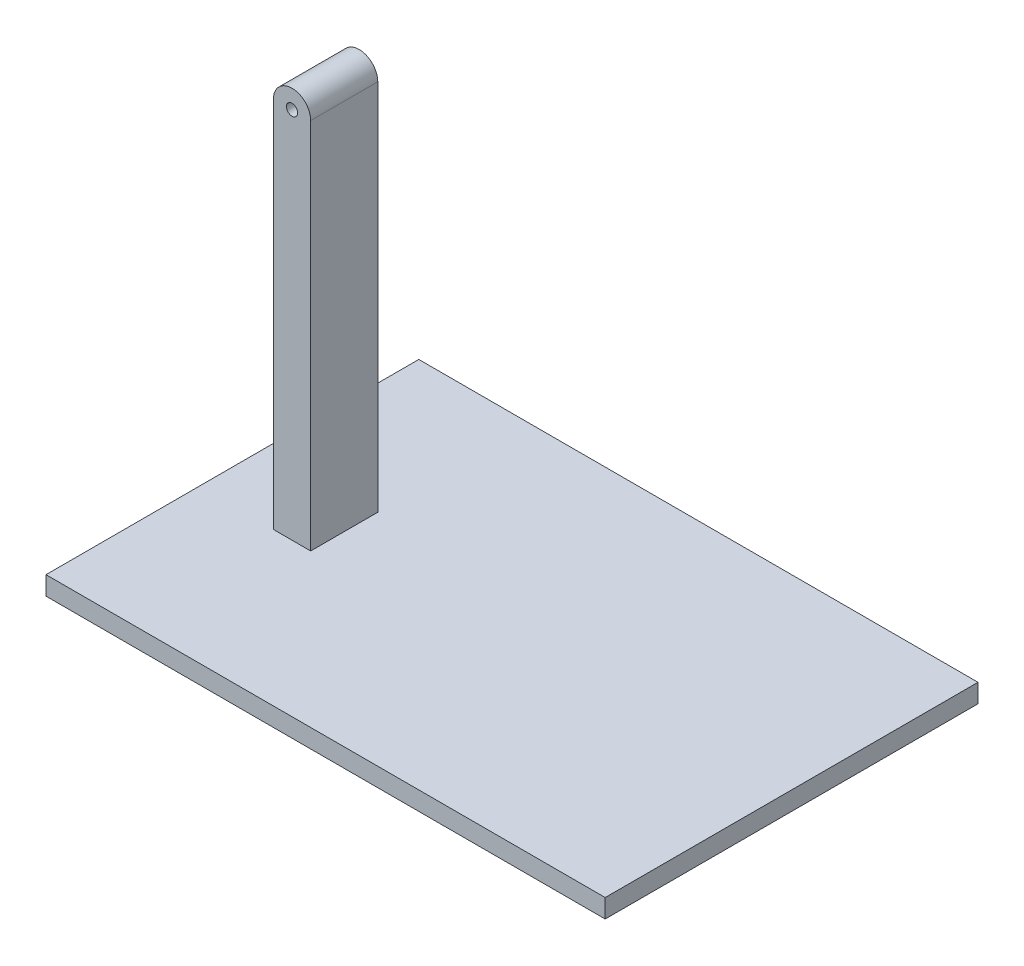
ISO-10303-21;
HEADER;
FILE_DESCRIPTION(('STEP AP214'),'2;1');
FILE_NAME('part.step','',(''),(''),'','','');
FILE_SCHEMA(('AUTOMOTIVE_DESIGN { 1 0 10303 214 1 1 1 1 }'));
ENDSEC;
DATA;
#1=APPLICATION_CONTEXT('core data for automotive mechanical design processes');
#2=APPLICATION_PROTOCOL_DEFINITION('international standard','automotive_design',2000,#1);
#3=PRODUCT_CONTEXT('',#1,'mechanical');
#4=PRODUCT('Part','Part','',(#3));
#5=PRODUCT_RELATED_PRODUCT_CATEGORY('part','',(#4));
#6=PRODUCT_DEFINITION_FORMATION('','',#4);
#7=PRODUCT_DEFINITION_CONTEXT('part definition',#1,'design');
#8=PRODUCT_DEFINITION('design','',#6,#7);
#9=PRODUCT_DEFINITION_SHAPE('','',#8);
#10=(LENGTH_UNIT() NAMED_UNIT(*) SI_UNIT(.MILLI.,.METRE.));
#11=(NAMED_UNIT(*) PLANE_ANGLE_UNIT() SI_UNIT($,.RADIAN.));
#12=(NAMED_UNIT(*) SI_UNIT($,.STERADIAN.) SOLID_ANGLE_UNIT());
#13=UNCERTAINTY_MEASURE_WITH_UNIT(LENGTH_MEASURE(1.E-05),#10,'distance_accuracy_value','');
#14=(GEOMETRIC_REPRESENTATION_CONTEXT(3) GLOBAL_UNCERTAINTY_ASSIGNED_CONTEXT((#13)) GLOBAL_UNIT_ASSIGNED_CONTEXT((#10,
#11,#12)) REPRESENTATION_CONTEXT('',''));
#15=CARTESIAN_POINT('',(0.,0.,0.));
#16=DIRECTION('',(0.,0.,1.));
#17=DIRECTION('',(1.,0.,0.));
#18=AXIS2_PLACEMENT_3D('',#15,#16,#17);
#19=CARTESIAN_POINT('',(0.,1.27,0.));
#20=DIRECTION('',(0.,-1.,0.));
#21=DIRECTION('',(0.,0.,-1.));
#22=AXIS2_PLACEMENT_3D('',#19,#20,#21);
#23=PLANE('',#22);
#24=DIRECTION('',(1.,0.,0.));
#25=VECTOR('',#24,1.);
#26=CARTESIAN_POINT('',(12.7,1.27,12.7));
#27=LINE('',#26,#25);
#28=CARTESIAN_POINT('',(-12.7,1.27,12.7));
#29=VERTEX_POINT('',#28);
#30=CARTESIAN_POINT('',(25.4,1.27,12.7));
#31=VERTEX_POINT('',#30);
#32=EDGE_CURVE('E138',#29,#31,#27,.T.);
#33=ORIENTED_EDGE('',*,*,#32,.T.);
#34=DIRECTION('',(0.,0.,-1.));
#35=VECTOR('',#34,1.);
#36=CARTESIAN_POINT('',(25.4,1.27,-12.7));
#37=LINE('',#36,#35);
#38=CARTESIAN_POINT('',(25.4,1.27,-12.7));
#39=VERTEX_POINT('',#38);
#40=EDGE_CURVE('E141',#31,#39,#37,.T.);
#41=ORIENTED_EDGE('',*,*,#40,.T.);
#42=DIRECTION('',(-1.,0.,0.));
#43=VECTOR('',#42,1.);
#44=CARTESIAN_POINT('',(12.7,1.27,-12.7));
#45=LINE('',#44,#43);
#46=CARTESIAN_POINT('',(-12.7,1.27,-12.7));
#47=VERTEX_POINT('',#46);
#48=EDGE_CURVE('E144',#39,#47,#45,.T.);
#49=ORIENTED_EDGE('',*,*,#48,.T.);
#50=DIRECTION('',(0.,0.,1.));
#51=VECTOR('',#50,1.);
#52=CARTESIAN_POINT('',(-12.7,1.27,-12.7));
#53=LINE('',#52,#51);
#54=EDGE_CURVE('E146',#47,#29,#53,.T.);
#55=ORIENTED_EDGE('',*,*,#54,.T.);
#56=EDGE_LOOP('',(#33,#41,#49,#55));
#57=FACE_BOUND('',#56,.T.);
#58=DIRECTION('',(0.,0.,-1.));
#59=VECTOR('',#58,1.);
#60=CARTESIAN_POINT('',(-5.08,1.27,2.286));
#61=LINE('',#60,#59);
#62=CARTESIAN_POINT('',(-5.08,1.27,2.286));
#63=VERTEX_POINT('',#62);
#64=CARTESIAN_POINT('',(-5.08,1.27,-2.286));
#65=VERTEX_POINT('',#64);
#66=EDGE_CURVE('E118',#63,#65,#61,.T.);
#67=ORIENTED_EDGE('',*,*,#66,.F.);
#68=DIRECTION('',(1.,0.,0.));
#69=VECTOR('',#68,1.);
#70=CARTESIAN_POINT('',(-7.62,1.27,2.286));
#71=LINE('',#70,#69);
#72=CARTESIAN_POINT('',(-7.62,1.27,2.286));
#73=VERTEX_POINT('',#72);
#74=EDGE_CURVE('E127',#73,#63,#71,.T.);
#75=ORIENTED_EDGE('',*,*,#74,.F.);
#76=DIRECTION('',(0.,0.,1.));
#77=VECTOR('',#76,1.);
#78=CARTESIAN_POINT('',(-7.62,1.27,2.286));
#79=LINE('',#78,#77);
#80=CARTESIAN_POINT('',(-7.62,1.27,-2.286));
#81=VERTEX_POINT('',#80);
#82=EDGE_CURVE('E53',#81,#73,#79,.T.);
#83=ORIENTED_EDGE('',*,*,#82,.F.);
#84=DIRECTION('',(-1.,0.,0.));
#85=VECTOR('',#84,1.);
#86=CARTESIAN_POINT('',(-7.62,1.27,-2.286));
#87=LINE('',#86,#85);
#88=EDGE_CURVE('E48',#65,#81,#87,.T.);
#89=ORIENTED_EDGE('',*,*,#88,.F.);
#90=EDGE_LOOP('',(#67,#75,#83,#89));
#91=FACE_BOUND('',#90,.T.);
#92=ADVANCED_FACE('F33',(#57,#91),#23,.F.);
#93=CARTESIAN_POINT('',(25.4,1.27,-12.7));
#94=DIRECTION('',(-1.,0.,0.));
#95=DIRECTION('',(0.,0.,1.));
#96=AXIS2_PLACEMENT_3D('',#93,#94,#95);
#97=PLANE('',#96);
#98=DIRECTION('',(0.,0.,-1.));
#99=VECTOR('',#98,1.);
#100=CARTESIAN_POINT('',(25.4,0.,-12.7));
#101=LINE('',#100,#99);
#102=CARTESIAN_POINT('',(25.4,0.,12.7));
#103=VERTEX_POINT('',#102);
#104=CARTESIAN_POINT('',(25.4,0.,-12.7));
#105=VERTEX_POINT('',#104);
#106=EDGE_CURVE('E137',#103,#105,#101,.T.);
#107=ORIENTED_EDGE('',*,*,#106,.T.);
#108=DIRECTION('',(0.,-1.,0.));
#109=VECTOR('',#108,1.);
#110=CARTESIAN_POINT('',(25.4,1.27,-12.7));
#111=LINE('',#110,#109);
#112=EDGE_CURVE('E41',#39,#105,#111,.T.);
#113=ORIENTED_EDGE('',*,*,#112,.F.);
#114=ORIENTED_EDGE('',*,*,#40,.F.);
#115=DIRECTION('',(0.,-1.,0.));
#116=VECTOR('',#115,1.);
#117=CARTESIAN_POINT('',(25.4,1.27,12.7));
#118=LINE('',#117,#116);
#119=EDGE_CURVE('E11',#31,#103,#118,.T.);
#120=ORIENTED_EDGE('',*,*,#119,.T.);
#121=EDGE_LOOP('',(#107,#113,#114,#120));
#122=FACE_BOUND('',#121,.T.);
#123=ADVANCED_FACE('F35',(#122),#97,.F.);
#124=CARTESIAN_POINT('',(-12.7,1.27,-12.7));
#125=DIRECTION('',(0.,0.,1.));
#126=DIRECTION('',(1.,0.,0.));
#127=AXIS2_PLACEMENT_3D('',#124,#125,#126);
#128=PLANE('',#127);
#129=DIRECTION('',(-1.,0.,0.));
#130=VECTOR('',#129,1.);
#131=CARTESIAN_POINT('',(-12.7,0.,-12.7));
#132=LINE('',#131,#130);
#133=CARTESIAN_POINT('',(-12.7,0.,-12.7));
#134=VERTEX_POINT('',#133);
#135=EDGE_CURVE('E152',#105,#134,#132,.T.);
#136=ORIENTED_EDGE('',*,*,#135,.T.);
#137=DIRECTION('',(0.,-1.,0.));
#138=VECTOR('',#137,1.);
#139=CARTESIAN_POINT('',(-12.7,1.27,-12.7));
#140=LINE('',#139,#138);
#141=EDGE_CURVE('E159',#47,#134,#140,.T.);
#142=ORIENTED_EDGE('',*,*,#141,.F.);
#143=ORIENTED_EDGE('',*,*,#48,.F.);
#144=ORIENTED_EDGE('',*,*,#112,.T.);
#145=EDGE_LOOP('',(#136,#142,#143,#144));
#146=FACE_BOUND('',#145,.T.);
#147=ADVANCED_FACE('F165',(#146),#128,.F.);
#148=CARTESIAN_POINT('',(-12.7,1.27,-12.7));
#149=DIRECTION('',(1.,0.,0.));
#150=DIRECTION('',(0.,0.,-1.));
#151=AXIS2_PLACEMENT_3D('',#148,#149,#150);
#152=PLANE('',#151);
#153=DIRECTION('',(0.,0.,1.));
#154=VECTOR('',#153,1.);
#155=CARTESIAN_POINT('',(-12.7,0.,-12.7));
#156=LINE('',#155,#154);
#157=CARTESIAN_POINT('',(-12.7,0.,12.7));
#158=VERTEX_POINT('',#157);
#159=EDGE_CURVE('E154',#134,#158,#156,.T.);
#160=ORIENTED_EDGE('',*,*,#159,.T.);
#161=DIRECTION('',(0.,-1.,0.));
#162=VECTOR('',#161,1.);
#163=CARTESIAN_POINT('',(-12.7,1.27,12.7));
#164=LINE('',#163,#162);
#165=EDGE_CURVE('E149',#29,#158,#164,.T.);
#166=ORIENTED_EDGE('',*,*,#165,.F.);
#167=ORIENTED_EDGE('',*,*,#54,.F.);
#168=ORIENTED_EDGE('',*,*,#141,.T.);
#169=EDGE_LOOP('',(#160,#166,#167,#168));
#170=FACE_BOUND('',#169,.T.);
#171=ADVANCED_FACE('F176',(#170),#152,.F.);
#172=CARTESIAN_POINT('',(-12.7,1.27,12.7));
#173=DIRECTION('',(0.,0.,-1.));
#174=DIRECTION('',(-1.,0.,0.));
#175=AXIS2_PLACEMENT_3D('',#172,#173,#174);
#176=PLANE('',#175);
#177=DIRECTION('',(1.,0.,0.));
#178=VECTOR('',#177,1.);
#179=CARTESIAN_POINT('',(-12.7,0.,12.7));
#180=LINE('',#179,#178);
#181=EDGE_CURVE('E142',#158,#103,#180,.T.);
#182=ORIENTED_EDGE('',*,*,#181,.T.);
#183=ORIENTED_EDGE('',*,*,#119,.F.);
#184=ORIENTED_EDGE('',*,*,#32,.F.);
#185=ORIENTED_EDGE('',*,*,#165,.T.);
#186=EDGE_LOOP('',(#182,#183,#184,#185));
#187=FACE_BOUND('',#186,.T.);
#188=ADVANCED_FACE('F179',(#187),#176,.F.);
#189=CARTESIAN_POINT('',(0.,0.,0.));
#190=DIRECTION('',(0.,-1.,0.));
#191=DIRECTION('',(0.,0.,-1.));
#192=AXIS2_PLACEMENT_3D('',#189,#190,#191);
#193=PLANE('',#192);
#194=ORIENTED_EDGE('',*,*,#106,.F.);
#195=ORIENTED_EDGE('',*,*,#181,.F.);
#196=ORIENTED_EDGE('',*,*,#159,.F.);
#197=ORIENTED_EDGE('',*,*,#135,.F.);
#198=EDGE_LOOP('',(#194,#195,#196,#197));
#199=FACE_BOUND('',#198,.T.);
#200=ADVANCED_FACE('F172',(#199),#193,.T.);
#201=CARTESIAN_POINT('',(-5.08,26.67,2.286));
#202=DIRECTION('',(-1.,0.,0.));
#203=DIRECTION('',(0.,0.,1.));
#204=AXIS2_PLACEMENT_3D('',#201,#202,#203);
#205=PLANE('',#204);
#206=ORIENTED_EDGE('',*,*,#66,.T.);
#207=DIRECTION('',(0.,-1.,0.));
#208=VECTOR('',#207,1.);
#209=CARTESIAN_POINT('',(-5.08,26.67,-2.286));
#210=LINE('',#209,#208);
#211=CARTESIAN_POINT('',(-5.08,26.67,-2.286));
#212=VERTEX_POINT('',#211);
#213=EDGE_CURVE('E113',#212,#65,#210,.T.);
#214=ORIENTED_EDGE('',*,*,#213,.F.);
#215=DIRECTION('',(0.,0.,-1.));
#216=VECTOR('',#215,1.);
#217=CARTESIAN_POINT('',(-5.08,26.67,2.286));
#218=LINE('',#217,#216);
#219=CARTESIAN_POINT('',(-5.08,26.67,2.286));
#220=VERTEX_POINT('',#219);
#221=EDGE_CURVE('E107',#220,#212,#218,.T.);
#222=ORIENTED_EDGE('',*,*,#221,.F.);
#223=DIRECTION('',(0.,-1.,0.));
#224=VECTOR('',#223,1.);
#225=CARTESIAN_POINT('',(-5.08,26.67,2.286));
#226=LINE('',#225,#224);
#227=EDGE_CURVE('E106',#220,#63,#226,.T.);
#228=ORIENTED_EDGE('',*,*,#227,.T.);
#229=EDGE_LOOP('',(#206,#214,#222,#228));
#230=FACE_BOUND('',#229,.T.);
#231=ADVANCED_FACE('F186',(#230),#205,.F.);
#232=CARTESIAN_POINT('',(-7.62,26.67,-2.286));
#233=DIRECTION('',(0.,0.,1.));
#234=DIRECTION('',(1.,0.,0.));
#235=AXIS2_PLACEMENT_3D('',#232,#233,#234);
#236=PLANE('',#235);
#237=CARTESIAN_POINT('',(-6.35,26.67,-2.286));
#238=DIRECTION('',(0.,0.,1.));
#239=DIRECTION('',(1.,0.,0.));
#240=AXIS2_PLACEMENT_3D('',#237,#238,#239);
#241=CIRCLE('',#240,0.381000000000001);
#242=CARTESIAN_POINT('',(-5.969,26.67,-2.286));
#243=VERTEX_POINT('',#242);
#244=EDGE_CURVE('E123',#243,#243,#241,.F.);
#245=ORIENTED_EDGE('',*,*,#244,.F.);
#246=EDGE_LOOP('',(#245));
#247=FACE_BOUND('',#246,.T.);
#248=DIRECTION('',(0.,-1.,0.));
#249=VECTOR('',#248,1.);
#250=CARTESIAN_POINT('',(-7.62,26.67,-2.286));
#251=LINE('',#250,#249);
#252=CARTESIAN_POINT('',(-7.62,26.67,-2.286));
#253=VERTEX_POINT('',#252);
#254=EDGE_CURVE('E99',#253,#81,#251,.T.);
#255=ORIENTED_EDGE('',*,*,#254,.F.);
#256=CARTESIAN_POINT('',(-6.35,26.67,-2.286));
#257=DIRECTION('',(0.,0.,1.));
#258=DIRECTION('',(1.,0.,0.));
#259=AXIS2_PLACEMENT_3D('',#256,#257,#258);
#260=CIRCLE('',#259,1.27);
#261=EDGE_CURVE('E112',#253,#212,#260,.F.);
#262=ORIENTED_EDGE('',*,*,#261,.T.);
#263=ORIENTED_EDGE('',*,*,#213,.T.);
#264=ORIENTED_EDGE('',*,*,#88,.T.);
#265=EDGE_LOOP('',(#255,#262,#263,#264));
#266=FACE_BOUND('',#265,.T.);
#267=ADVANCED_FACE('F111',(#247,#266),#236,.F.);
#268=CARTESIAN_POINT('',(-7.62,26.67,2.286));
#269=DIRECTION('',(1.,0.,0.));
#270=DIRECTION('',(0.,0.,-1.));
#271=AXIS2_PLACEMENT_3D('',#268,#269,#270);
#272=PLANE('',#271);
#273=ORIENTED_EDGE('',*,*,#82,.T.);
#274=DIRECTION('',(0.,-1.,0.));
#275=VECTOR('',#274,1.);
#276=CARTESIAN_POINT('',(-7.62,26.67,2.286));
#277=LINE('',#276,#275);
#278=CARTESIAN_POINT('',(-7.62,26.67,2.286));
#279=VERTEX_POINT('',#278);
#280=EDGE_CURVE('E101',#279,#73,#277,.T.);
#281=ORIENTED_EDGE('',*,*,#280,.F.);
#282=DIRECTION('',(0.,0.,1.));
#283=VECTOR('',#282,1.);
#284=CARTESIAN_POINT('',(-7.62,26.67,2.286));
#285=LINE('',#284,#283);
#286=EDGE_CURVE('E96',#253,#279,#285,.T.);
#287=ORIENTED_EDGE('',*,*,#286,.F.);
#288=ORIENTED_EDGE('',*,*,#254,.T.);
#289=EDGE_LOOP('',(#273,#281,#287,#288));
#290=FACE_BOUND('',#289,.T.);
#291=ADVANCED_FACE('F98',(#290),#272,.F.);
#292=CARTESIAN_POINT('',(-7.62,26.67,2.286));
#293=DIRECTION('',(0.,0.,-1.));
#294=DIRECTION('',(-1.,0.,0.));
#295=AXIS2_PLACEMENT_3D('',#292,#293,#294);
#296=PLANE('',#295);
#297=CARTESIAN_POINT('',(-6.35,26.67,2.286));
#298=DIRECTION('',(0.,0.,1.));
#299=DIRECTION('',(1.,0.,0.));
#300=AXIS2_PLACEMENT_3D('',#297,#298,#299);
#301=CIRCLE('',#300,0.381000000000001);
#302=CARTESIAN_POINT('',(-5.969,26.67,2.286));
#303=VERTEX_POINT('',#302);
#304=EDGE_CURVE('E270',#303,#303,#301,.T.);
#305=ORIENTED_EDGE('',*,*,#304,.F.);
#306=EDGE_LOOP('',(#305));
#307=FACE_BOUND('',#306,.T.);
#308=ORIENTED_EDGE('',*,*,#227,.F.);
#309=CARTESIAN_POINT('',(-6.35,26.67,2.286));
#310=DIRECTION('',(0.,0.,1.));
#311=DIRECTION('',(1.,0.,0.));
#312=AXIS2_PLACEMENT_3D('',#309,#310,#311);
#313=CIRCLE('',#312,1.27);
#314=EDGE_CURVE('E119',#220,#279,#313,.T.);
#315=ORIENTED_EDGE('',*,*,#314,.T.);
#316=ORIENTED_EDGE('',*,*,#280,.T.);
#317=ORIENTED_EDGE('',*,*,#74,.T.);
#318=EDGE_LOOP('',(#308,#315,#316,#317));
#319=FACE_BOUND('',#318,.T.);
#320=ADVANCED_FACE('F185',(#307,#319),#296,.F.);
#321=CARTESIAN_POINT('',(-6.35,26.67,-5.87810244842766));
#322=DIRECTION('',(0.,0.,1.));
#323=DIRECTION('',(1.,0.,0.));
#324=AXIS2_PLACEMENT_3D('',#321,#322,#323);
#325=CYLINDRICAL_SURFACE('',#324,1.27);
#326=ORIENTED_EDGE('',*,*,#221,.T.);
#327=ORIENTED_EDGE('',*,*,#261,.F.);
#328=ORIENTED_EDGE('',*,*,#286,.T.);
#329=ORIENTED_EDGE('',*,*,#314,.F.);
#330=EDGE_LOOP('',(#326,#327,#328,#329));
#331=FACE_BOUND('',#330,.T.);
#332=ADVANCED_FACE('F116',(#331),#325,.T.);
#333=CARTESIAN_POINT('',(-6.35,26.67,-3.3636307345283));
#334=DIRECTION('',(0.,0.,1.));
#335=DIRECTION('',(1.,0.,0.));
#336=AXIS2_PLACEMENT_3D('',#333,#334,#335);
#337=CYLINDRICAL_SURFACE('',#336,0.381000000000001);
#338=ORIENTED_EDGE('',*,*,#244,.T.);
#339=EDGE_LOOP('',(#338));
#340=FACE_BOUND('',#339,.T.);
#341=ORIENTED_EDGE('',*,*,#304,.T.);
#342=EDGE_LOOP('',(#341));
#343=FACE_BOUND('',#342,.T.);
#344=ADVANCED_FACE('F238',(#340,#343),#337,.F.);
#345=CLOSED_SHELL('',(#92,#123,#147,#171,#188,#200,#231,#267,#291,#320,#332,#344));
#346=MANIFOLD_SOLID_BREP('B2',#345);
#347=ADVANCED_BREP_SHAPE_REPRESENTATION('',(#18,#346),#14);
#348=SHAPE_DEFINITION_REPRESENTATION(#9,#347);
ENDSEC;
END-ISO-10303-21;
